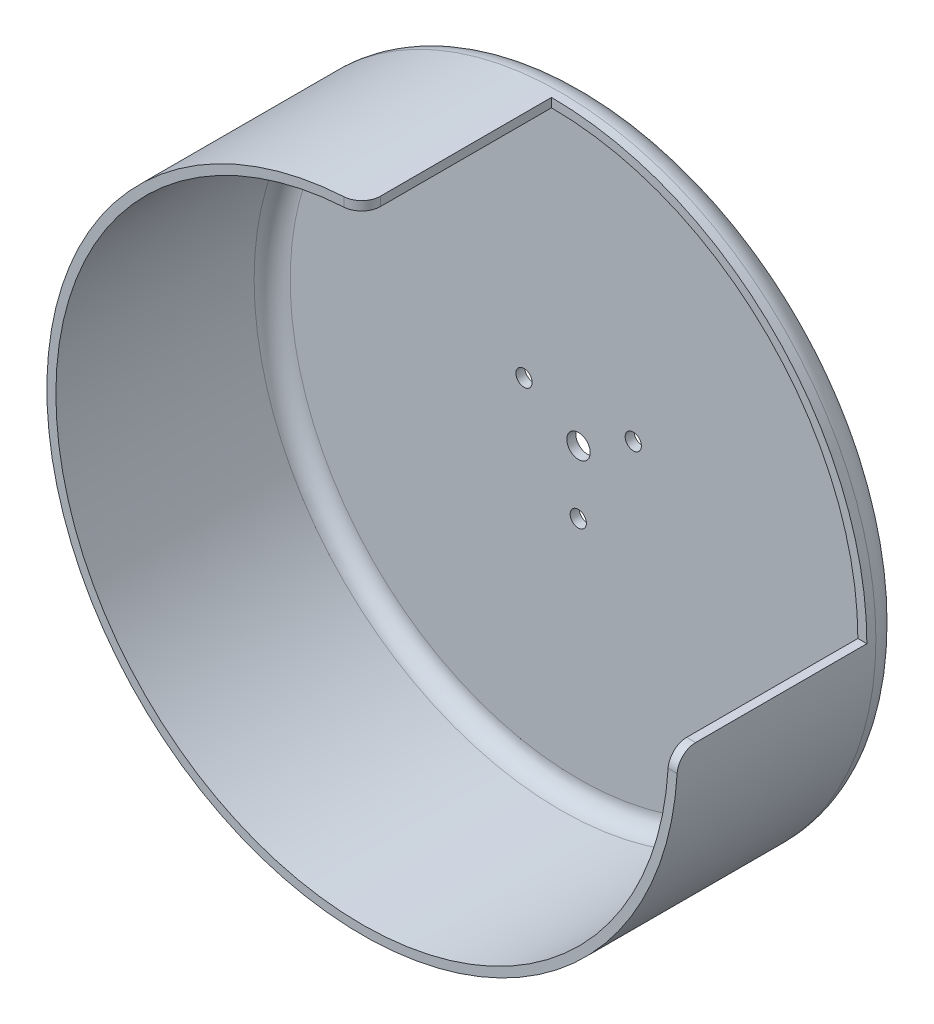
ISO-10303-21;
HEADER;
FILE_DESCRIPTION(('STEP AP214'),'2;1');
FILE_NAME('part.step','',(''),(''),'','','');
FILE_SCHEMA(('AUTOMOTIVE_DESIGN { 1 0 10303 214 1 1 1 1 }'));
ENDSEC;
DATA;
#1=APPLICATION_CONTEXT('core data for automotive mechanical design processes');
#2=APPLICATION_PROTOCOL_DEFINITION('international standard','automotive_design',2000,#1);
#3=PRODUCT_CONTEXT('',#1,'mechanical');
#4=PRODUCT('Part','Part','',(#3));
#5=PRODUCT_RELATED_PRODUCT_CATEGORY('part','',(#4));
#6=PRODUCT_DEFINITION_FORMATION('','',#4);
#7=PRODUCT_DEFINITION_CONTEXT('part definition',#1,'design');
#8=PRODUCT_DEFINITION('design','',#6,#7);
#9=PRODUCT_DEFINITION_SHAPE('','',#8);
#10=(LENGTH_UNIT() NAMED_UNIT(*) SI_UNIT(.MILLI.,.METRE.));
#11=(NAMED_UNIT(*) PLANE_ANGLE_UNIT() SI_UNIT($,.RADIAN.));
#12=(NAMED_UNIT(*) SI_UNIT($,.STERADIAN.) SOLID_ANGLE_UNIT());
#13=UNCERTAINTY_MEASURE_WITH_UNIT(LENGTH_MEASURE(1.E-05),#10,'distance_accuracy_value','');
#14=(GEOMETRIC_REPRESENTATION_CONTEXT(3) GLOBAL_UNCERTAINTY_ASSIGNED_CONTEXT((#13)) GLOBAL_UNIT_ASSIGNED_CONTEXT((#10,
#11,#12)) REPRESENTATION_CONTEXT('',''));
#15=CARTESIAN_POINT('',(0.,0.,0.));
#16=DIRECTION('',(0.,0.,1.));
#17=DIRECTION('',(1.,0.,0.));
#18=AXIS2_PLACEMENT_3D('',#15,#16,#17);
#19=CARTESIAN_POINT('',(0.,0.,125.));
#20=DIRECTION('',(0.,0.,-1.));
#21=DIRECTION('',(-1.,0.,0.));
#22=AXIS2_PLACEMENT_3D('',#19,#20,#21);
#23=CYLINDRICAL_SURFACE('',#22,175.);
#24=CARTESIAN_POINT('',(0.,0.,15.));
#25=DIRECTION('',(0.,0.,1.));
#26=DIRECTION('',(1.,0.,0.));
#27=AXIS2_PLACEMENT_3D('',#24,#25,#26);
#28=CIRCLE('',#27,175.);
#29=CARTESIAN_POINT('',(175.,0.,15.));
#30=VERTEX_POINT('',#29);
#31=EDGE_CURVE('E127',#30,#30,#28,.T.);
#32=ORIENTED_EDGE('',*,*,#31,.T.);
#33=EDGE_LOOP('',(#32));
#34=FACE_BOUND('',#33,.T.);
#35=DIRECTION('',(0.,0.,-1.));
#36=VECTOR('',#35,1.);
#37=CARTESIAN_POINT('',(175.,0.,125.));
#38=LINE('',#37,#36);
#39=CARTESIAN_POINT('',(175.,0.,115.));
#40=VERTEX_POINT('',#39);
#41=CARTESIAN_POINT('',(175.,0.,20.));
#42=VERTEX_POINT('',#41);
#43=EDGE_CURVE('E89',#40,#42,#38,.T.);
#44=ORIENTED_EDGE('',*,*,#43,.F.);
#45=CARTESIAN_POINT('',(175.,0.,115.));
#46=CARTESIAN_POINT('',(174.999994892222,3.02398528542552E-05,115.28125147425));
#47=CARTESIAN_POINT('',(174.999999839605,-0.0118640897200235,115.562498606137));
#48=CARTESIAN_POINT('',(174.999992929181,-0.0592834783585311,116.122980780399));
#49=CARTESIAN_POINT('',(174.99998107218,-0.0948074071604252,116.402215918368));
#50=CARTESIAN_POINT('',(174.99990367308,-0.189232212942811,116.956490123784));
#51=CARTESIAN_POINT('',(174.999838171239,-0.248115543132159,117.231532180264));
#52=CARTESIAN_POINT('',(174.999582255961,-0.388830803912559,117.775677944453));
#53=CARTESIAN_POINT('',(174.999391844049,-0.470662454310407,118.044781724624));
#54=CARTESIAN_POINT('',(174.998792383619,-0.656740455602465,118.57526956643));
#55=CARTESIAN_POINT('',(174.998383230455,-0.760997520385164,118.836649869996));
#56=CARTESIAN_POINT('',(174.997230930753,-0.991163412497808,119.349702759875));
#57=CARTESIAN_POINT('',(174.996487777208,-1.11707269390994,119.601375142461));
#58=CARTESIAN_POINT('',(174.994535661659,-1.38962078932135,120.093171113706));
#59=CARTESIAN_POINT('',(174.99332678503,-1.53625580079054,120.333296810018));
#60=CARTESIAN_POINT('',(174.990299257271,-1.84922825400883,120.800339608811));
#61=CARTESIAN_POINT('',(174.988480609517,-2.01556558668248,121.027256784405));
#62=CARTESIAN_POINT('',(174.984083250416,-2.36673350274791,121.466238253799));
#63=CARTESIAN_POINT('',(174.981504647814,-2.55156143775629,121.678304667277));
#64=CARTESIAN_POINT('',(174.975435818167,-2.93841303379434,122.086111744753));
#65=CARTESIAN_POINT('',(174.971945591629,-3.14043668526977,122.281852417822));
#66=CARTESIAN_POINT('',(174.96390626256,-3.56027873274718,122.65565171139));
#67=CARTESIAN_POINT('',(174.959356958049,-3.77810013614725,122.833706949767));
#68=CARTESIAN_POINT('',(174.949064292085,-4.22794372083137,123.170824159868));
#69=CARTESIAN_POINT('',(174.943320949441,-4.459965678399,123.329886430692));
#70=CARTESIAN_POINT('',(174.93052350261,-4.93646813234572,123.627837003842));
#71=CARTESIAN_POINT('',(174.923469879389,-5.18094403343454,123.766732675496));
#72=CARTESIAN_POINT('',(174.907954071214,-5.68067724046133,124.023434110065));
#73=CARTESIAN_POINT('',(174.899491909682,-5.93593436708343,124.141240223576));
#74=CARTESIAN_POINT('',(174.881092313057,-6.45530857954798,124.354889537395));
#75=CARTESIAN_POINT('',(174.871155526444,-6.71942173155645,124.450742344972));
#76=CARTESIAN_POINT('',(174.849770800619,-7.2546145110467,124.61985703665));
#77=CARTESIAN_POINT('',(174.838323221548,-7.52569246590007,124.69312429084));
#78=CARTESIAN_POINT('',(174.810001490825,-8.16049632651197,124.836314411567));
#79=CARTESIAN_POINT('',(174.792561510118,-8.52617763219225,124.897705856778));
#80=CARTESIAN_POINT('',(174.76450454658,-9.07755022000016,124.95908190891));
#81=CARTESIAN_POINT('',(174.754841455042,-9.26172181222213,124.974422065663));
#82=CARTESIAN_POINT('',(174.734901889189,-9.63058607172551,124.994879829498));
#83=CARTESIAN_POINT('',(174.7246254574,-9.81527870203658,124.999998144467));
#84=CARTESIAN_POINT('',(174.714052096561,-10.,125.));
#85=B_SPLINE_CURVE_WITH_KNOTS('',3,(#45,#46,#47,#48,#49,#50,#51,#52,#53,#54,#55,#56,#57,#58,#59,
#60,#61,#62,#63,#64,#65,#66,#67,#68,#69,#70,#71,#72,#73,#74,#75,#76,#77,#78,#79,#80,#81,#82,#83,
#84),.UNSPECIFIED.,.F.,.F.,(4,2,2,2,2,2,2,2,2,2,2,2,2,2,2,2,2,2,2,4),(0.,0.843496900529733,
1.68695345736179,2.52977763424749,3.37259152091049,4.21580896534211,5.0590440955715,
5.90212471858356,6.74520067437359,7.58815604997093,8.43111095721021,9.27422676006706,
10.1173292838423,10.9601229393869,11.8029025829052,12.6453126990533,13.4875223635445,
14.598545050804,15.1534922951335,15.7084011066519),.UNSPECIFIED.);
#86=CARTESIAN_POINT('',(174.714052096561,-10.,125.));
#87=VERTEX_POINT('',#86);
#88=EDGE_CURVE('E59',#40,#87,#85,.T.);
#89=ORIENTED_EDGE('',*,*,#88,.T.);
#90=CARTESIAN_POINT('',(0.,0.,125.));
#91=DIRECTION('',(0.,0.,1.));
#92=DIRECTION('',(1.,0.,0.));
#93=AXIS2_PLACEMENT_3D('',#90,#91,#92);
#94=CIRCLE('',#93,175.);
#95=CARTESIAN_POINT('',(-10.0000000000006,174.714052096561,125.));
#96=VERTEX_POINT('',#95);
#97=EDGE_CURVE('E114',#96,#87,#94,.T.);
#98=ORIENTED_EDGE('',*,*,#97,.F.);
#99=CARTESIAN_POINT('',(-10.0000000000006,174.714052096561,125.));
#100=CARTESIAN_POINT('',(-9.71924358284053,174.730128401738,125.000030359813));
#101=CARTESIAN_POINT('',(-9.43845042142782,174.745514433812,124.988177607693));
#102=CARTESIAN_POINT('',(-8.87878911571973,174.774840818622,124.940904589863));
#103=CARTESIAN_POINT('',(-8.59992090003551,174.788781225241,124.905485202946));
#104=CARTESIAN_POINT('',(-8.04628946510728,174.815142782463,124.811312079252));
#105=CARTESIAN_POINT('',(-7.77152339037183,174.827565037714,124.752575442566));
#106=CARTESIAN_POINT('',(-7.22784990919246,174.850885543135,124.612179464307));
#107=CARTESIAN_POINT('',(-6.95894241132248,174.861783817101,124.530520480724));
#108=CARTESIAN_POINT('',(-6.42876055196706,174.882078758652,124.344794825878));
#109=CARTESIAN_POINT('',(-6.16749032544867,174.891474624674,124.240716262387));
#110=CARTESIAN_POINT('',(-5.65459603087495,174.908808785999,124.010906362371));
#111=CARTESIAN_POINT('',(-5.40297216279331,174.916747051097,123.885174577261));
#112=CARTESIAN_POINT('',(-4.91122618914184,174.931244671529,123.612975223143));
#113=CARTESIAN_POINT('',(-4.67110179081402,174.937804302624,123.466511810826));
#114=CARTESIAN_POINT('',(-4.20401945545639,174.949652207129,123.153869433743));
#115=CARTESIAN_POINT('',(-3.97706143688348,174.954940488413,122.9876905911));
#116=CARTESIAN_POINT('',(-3.53812208986469,174.964367376378,122.63694885075));
#117=CARTESIAN_POINT('',(-3.326127993012,174.968506972272,122.45240195832));
#118=CARTESIAN_POINT('',(-2.9184119749696,174.975782480487,122.066114470968));
#119=CARTESIAN_POINT('',(-2.72269005648684,174.978918392641,121.864373873187));
#120=CARTESIAN_POINT('',(-2.34887295217695,174.984335747994,121.445087761269));
#121=CARTESIAN_POINT('',(-2.170781460415,174.986617012399,121.227538951361));
#122=CARTESIAN_POINT('',(-1.83354156287962,174.99047566243,120.77822291771));
#123=CARTESIAN_POINT('',(-1.67439287774756,174.992053058438,120.546455903727));
#124=CARTESIAN_POINT('',(-1.37607988856676,174.994653283278,120.07020678183));
#125=CARTESIAN_POINT('',(-1.23692729472386,174.995675788117,119.825717336572));
#126=CARTESIAN_POINT('',(-0.979709176579322,174.997304888308,119.32589353835));
#127=CARTESIAN_POINT('',(-0.861643312107746,174.99791149037,119.070559360416));
#128=CARTESIAN_POINT('',(-0.647482683750946,174.998834978388,118.550961393104));
#129=CARTESIAN_POINT('',(-0.55137799207792,174.999151995451,118.286701700863));
#130=CARTESIAN_POINT('',(-0.381777989140229,174.999604030813,117.751133933127));
#131=CARTESIAN_POINT('',(-0.308277303941761,174.999739092397,117.479827549589));
#132=CARTESIAN_POINT('',(-0.164507192141762,174.99994226013,116.844045536076));
#133=CARTESIAN_POINT('',(-0.102819961869466,174.999975043965,116.477572320914));
#134=CARTESIAN_POINT('',(-0.0411357184168811,174.999996164496,115.924886342338));
#135=CARTESIAN_POINT('',(-0.025715417854047,174.99999853456,115.740253789983));
#136=CARTESIAN_POINT('',(-0.00514883053197344,175.000000104599,115.37042948504));
#137=CARTESIAN_POINT('',(-1.86627262026528E-06,174.999999304782,115.185237770134));
#138=CARTESIAN_POINT('',(-6.10388961846379E-13,175.,115.));
#139=B_SPLINE_CURVE_WITH_KNOTS('',3,(#99,#100,#101,#102,#103,#104,#105,#106,#107,#108,#109,#110,
#111,#112,#113,#114,#115,#116,#117,#118,#119,#120,#121,#122,#123,#124,#125,#126,#127,#128,#129,
#130,#131,#132,#133,#134,#135,#136,#137,#138),.UNSPECIFIED.,.F.,.F.,(4,2,2,2,2,2,2,2,2,2,2,2,2,
2,2,2,2,2,2,4),(0.,0.843394586061134,1.68675772397901,2.52950350677246,3.37223612865741,
4.21541687478618,5.05861509102023,5.90164448490288,6.74466865710989,7.58696457378324,
8.42926063057613,9.27173279995783,10.1141925434602,10.957143658971,11.8000811748128,
12.6426368743721,13.4849921074739,14.5972647841675,15.1528513342814,15.7084012436802),.UNSPECIFIED.);
#140=CARTESIAN_POINT('',(-6.11009234297548E-13,175.,115.));
#141=VERTEX_POINT('',#140);
#142=EDGE_CURVE('E136',#96,#141,#139,.T.);
#143=ORIENTED_EDGE('',*,*,#142,.T.);
#144=DIRECTION('',(0.,0.,-1.));
#145=VECTOR('',#144,1.);
#146=CARTESIAN_POINT('',(-6.11009234297548E-13,175.,125.));
#147=LINE('',#146,#145);
#148=CARTESIAN_POINT('',(-6.11009234297548E-13,175.,20.));
#149=VERTEX_POINT('',#148);
#150=EDGE_CURVE('E111',#141,#149,#147,.T.);
#151=ORIENTED_EDGE('',*,*,#150,.T.);
#152=CARTESIAN_POINT('',(0.,0.,20.));
#153=DIRECTION('',(0.,0.,-1.));
#154=DIRECTION('',(-1.,0.,0.));
#155=AXIS2_PLACEMENT_3D('',#152,#153,#154);
#156=CIRCLE('',#155,175.);
#157=EDGE_CURVE('E103',#149,#42,#156,.T.);
#158=ORIENTED_EDGE('',*,*,#157,.T.);
#159=EDGE_LOOP('',(#44,#89,#98,#143,#151,#158));
#160=FACE_BOUND('',#159,.T.);
#161=ADVANCED_FACE('F32',(#34,#160),#23,.T.);
#162=CARTESIAN_POINT('',(0.,0.,125.));
#163=DIRECTION('',(0.,0.,1.));
#164=DIRECTION('',(1.,0.,0.));
#165=AXIS2_PLACEMENT_3D('',#162,#163,#164);
#166=PLANE('',#165);
#167=ORIENTED_EDGE('',*,*,#97,.T.);
#168=DIRECTION('',(1.,0.,0.));
#169=VECTOR('',#168,1.);
#170=CARTESIAN_POINT('',(0.,-10.,125.));
#171=LINE('',#170,#169);
#172=CARTESIAN_POINT('',(169.705627484771,-10.,125.));
#173=VERTEX_POINT('',#172);
#174=EDGE_CURVE('E45',#87,#173,#171,.F.);
#175=ORIENTED_EDGE('',*,*,#174,.T.);
#176=CARTESIAN_POINT('',(0.,0.,125.));
#177=DIRECTION('',(0.,0.,1.));
#178=DIRECTION('',(1.,0.,0.));
#179=AXIS2_PLACEMENT_3D('',#176,#177,#178);
#180=CIRCLE('',#179,170.);
#181=CARTESIAN_POINT('',(-10.0000000000006,169.705627484771,125.));
#182=VERTEX_POINT('',#181);
#183=EDGE_CURVE('E112',#182,#173,#180,.T.);
#184=ORIENTED_EDGE('',*,*,#183,.F.);
#185=DIRECTION('',(0.,1.,0.));
#186=VECTOR('',#185,1.);
#187=CARTESIAN_POINT('',(-10.0000000000006,175.,125.));
#188=LINE('',#187,#186);
#189=EDGE_CURVE('E133',#182,#96,#188,.T.);
#190=ORIENTED_EDGE('',*,*,#189,.T.);
#191=EDGE_LOOP('',(#167,#175,#184,#190));
#192=FACE_BOUND('',#191,.T.);
#193=ADVANCED_FACE('F151',(#192),#166,.T.);
#194=CARTESIAN_POINT('',(0.,0.,0.));
#195=DIRECTION('',(0.,0.,1.));
#196=DIRECTION('',(1.,0.,0.));
#197=AXIS2_PLACEMENT_3D('',#194,#195,#196);
#198=PLANE('',#197);
#199=CARTESIAN_POINT('',(30.3777801302187,17.3836266170235,0.));
#200=DIRECTION('',(0.,0.,1.));
#201=DIRECTION('',(1.,0.,0.));
#202=AXIS2_PLACEMENT_3D('',#199,#200,#201);
#203=CIRCLE('',#202,4.5);
#204=CARTESIAN_POINT('',(34.8777801302187,17.3836266170235,0.));
#205=VERTEX_POINT('',#204);
#206=EDGE_CURVE('E228',#205,#205,#203,.T.);
#207=ORIENTED_EDGE('',*,*,#206,.T.);
#208=EDGE_LOOP('',(#207));
#209=FACE_BOUND('',#208,.T.);
#210=CARTESIAN_POINT('',(-0.134227804863798,-34.9997426118593,0.));
#211=DIRECTION('',(0.,0.,1.));
#212=DIRECTION('',(1.,0.,0.));
#213=AXIS2_PLACEMENT_3D('',#210,#211,#212);
#214=CIRCLE('',#213,4.5);
#215=CARTESIAN_POINT('',(4.3657721951362,-34.9997426118593,0.));
#216=VERTEX_POINT('',#215);
#217=EDGE_CURVE('E232',#216,#216,#214,.T.);
#218=ORIENTED_EDGE('',*,*,#217,.T.);
#219=EDGE_LOOP('',(#218));
#220=FACE_BOUND('',#219,.T.);
#221=CARTESIAN_POINT('',(-30.2435523253549,17.6161159948361,0.));
#222=DIRECTION('',(0.,0.,1.));
#223=DIRECTION('',(1.,0.,0.));
#224=AXIS2_PLACEMENT_3D('',#221,#222,#223);
#225=CIRCLE('',#224,4.5);
#226=CARTESIAN_POINT('',(-25.7435523253549,17.6161159948361,0.));
#227=VERTEX_POINT('',#226);
#228=EDGE_CURVE('E241',#227,#227,#225,.T.);
#229=ORIENTED_EDGE('',*,*,#228,.T.);
#230=EDGE_LOOP('',(#229));
#231=FACE_BOUND('',#230,.T.);
#232=CARTESIAN_POINT('',(0.,0.,0.));
#233=DIRECTION('',(0.,0.,1.));
#234=DIRECTION('',(1.,0.,0.));
#235=AXIS2_PLACEMENT_3D('',#232,#233,#234);
#236=CIRCLE('',#235,6.5);
#237=CARTESIAN_POINT('',(6.5,0.,0.));
#238=VERTEX_POINT('',#237);
#239=EDGE_CURVE('E98',#238,#238,#236,.T.);
#240=ORIENTED_EDGE('',*,*,#239,.T.);
#241=EDGE_LOOP('',(#240));
#242=FACE_BOUND('',#241,.T.);
#243=CARTESIAN_POINT('',(0.,0.,0.));
#244=DIRECTION('',(0.,0.,1.));
#245=DIRECTION('',(1.,0.,0.));
#246=AXIS2_PLACEMENT_3D('',#243,#244,#245);
#247=CIRCLE('',#246,160.);
#248=CARTESIAN_POINT('',(160.,0.,0.));
#249=VERTEX_POINT('',#248);
#250=EDGE_CURVE('E130',#249,#249,#247,.F.);
#251=ORIENTED_EDGE('',*,*,#250,.T.);
#252=EDGE_LOOP('',(#251));
#253=FACE_BOUND('',#252,.T.);
#254=ADVANCED_FACE('F153',(#209,#220,#231,#242,#253),#198,.F.);
#255=CARTESIAN_POINT('',(0.,0.,125.));
#256=DIRECTION('',(0.,0.,-1.));
#257=DIRECTION('',(-1.,0.,0.));
#258=AXIS2_PLACEMENT_3D('',#255,#256,#257);
#259=CYLINDRICAL_SURFACE('',#258,170.);
#260=CARTESIAN_POINT('',(0.,0.,15.));
#261=DIRECTION('',(0.,0.,1.));
#262=DIRECTION('',(1.,0.,0.));
#263=AXIS2_PLACEMENT_3D('',#260,#261,#262);
#264=CIRCLE('',#263,170.);
#265=CARTESIAN_POINT('',(170.,0.,15.));
#266=VERTEX_POINT('',#265);
#267=EDGE_CURVE('E124',#266,#266,#264,.F.);
#268=ORIENTED_EDGE('',*,*,#267,.T.);
#269=EDGE_LOOP('',(#268));
#270=FACE_BOUND('',#269,.T.);
#271=ORIENTED_EDGE('',*,*,#183,.T.);
#272=CARTESIAN_POINT('',(169.705627484771,-10.,125.));
#273=CARTESIAN_POINT('',(169.722176465164,-9.7192736903606,125.000030366613));
#274=CARTESIAN_POINT('',(169.738014961169,-9.43850818552635,124.988180141239));
#275=CARTESIAN_POINT('',(169.768203933085,-8.87889698483317,124.940916041262));
#276=CARTESIAN_POINT('',(169.782554463515,-8.60005121898717,124.905503030323));
#277=CARTESIAN_POINT('',(169.809691758672,-8.04645913239074,124.811345276624));
#278=CARTESIAN_POINT('',(169.822479658256,-7.77170996535653,124.752617599376));
#279=CARTESIAN_POINT('',(169.846486742159,-7.22806551553177,124.612241159697));
#280=CARTESIAN_POINT('',(169.857705951291,-6.9591701402032,124.530592759886));
#281=CARTESIAN_POINT('',(169.878598710019,-6.42900729806899,124.344888755505));
#282=CARTESIAN_POINT('',(169.888271429434,-6.1677439893722,124.240821185848));
#283=CARTESIAN_POINT('',(169.906116456283,-5.65485984289939,124.011033292972));
#284=CARTESIAN_POINT('',(169.914288732664,-5.40323920476951,123.88531252173));
#285=CARTESIAN_POINT('',(169.929213808422,-4.91149688515462,123.613134923551));
#286=CARTESIAN_POINT('',(169.935966893022,-4.67137290063233,123.466682273129));
#287=CARTESIAN_POINT('',(169.948164284981,-4.2042889549479,123.154060816414));
#288=CARTESIAN_POINT('',(169.953608600509,-3.97732891162504,122.987892133195));
#289=CARTESIAN_POINT('',(169.963313450578,-3.5383948282431,122.63717894909));
#290=CARTESIAN_POINT('',(169.967575063643,-3.32640726697199,122.452651399962));
#291=CARTESIAN_POINT('',(169.975065129626,-2.91870109378392,122.066403527707));
#292=CARTESIAN_POINT('',(169.978293582364,-2.72298248471154,121.864683201574));
#293=CARTESIAN_POINT('',(169.983870902175,-2.34916883809588,121.44543828075));
#294=CARTESIAN_POINT('',(169.986219584912,-2.17107749968761,121.227910385333));
#295=CARTESIAN_POINT('',(169.990192357067,-1.83383486627035,120.778636644488));
#296=CARTESIAN_POINT('',(169.991816457145,-1.67468329266968,120.546891008271));
#297=CARTESIAN_POINT('',(169.994493775723,-1.37635821177166,120.070679615096));
#298=CARTESIAN_POINT('',(169.995546648079,-1.23719685538734,119.826206243634));
#299=CARTESIAN_POINT('',(169.997224185904,-0.97995912594128,119.326414070102));
#300=CARTESIAN_POINT('',(169.99784885827,-0.861882413392274,119.071095442735));
#301=CARTESIAN_POINT('',(169.998799900078,-0.647698018407803,118.551527742581));
#302=CARTESIAN_POINT('',(169.999126404401,-0.551580417315926,118.287282763872));
#303=CARTESIAN_POINT('',(169.999591999165,-0.381952629643169,117.751743474542));
#304=CARTESIAN_POINT('',(169.999731134149,-0.308437073238509,117.480450854944));
#305=CARTESIAN_POINT('',(169.999940492236,-0.164603585355966,116.844581366987));
#306=CARTESIAN_POINT('',(169.999974279823,-0.102880264565263,116.478003376095));
#307=CARTESIAN_POINT('',(169.999996047043,-0.0411598721645464,115.925157347325));
#308=CARTESIAN_POINT('',(169.999998489683,-0.0257305197627736,115.740470887725));
#309=CARTESIAN_POINT('',(170.000000107804,-0.0051518582440614,115.370538294447));
#310=CARTESIAN_POINT('',(169.999999283501,-1.86977894450687E-06,115.185292198565));
#311=CARTESIAN_POINT('',(170.,0.,115.));
#312=B_SPLINE_CURVE_WITH_KNOTS('',3,(#272,#273,#274,#275,#276,#277,#278,#279,#280,#281,#282,
#283,#284,#285,#286,#287,#288,#289,#290,#291,#292,#293,#294,#295,#296,#297,#298,#299,#300,#301,
#302,#303,#304,#305,#306,#307,#308,#309,#310,#311),.UNSPECIFIED.,.F.,.F.,(4,2,2,2,2,2,2,2,2,2,2,
2,2,2,2,2,2,2,2,4),(0.,0.843386862433242,1.68674281331487,2.52948259224286,3.37220903926826,
4.21538636764182,5.05858114411238,5.9016062969314,6.74462618757179,7.58687477080561,
8.42912350130372,9.27154860711524,10.1139613198664,10.9568839399474,11.7997929867706,
12.6423205460289,13.4846477815128,14.5972459805361,15.152995747497,15.7087087845496),.UNSPECIFIED.);
#313=CARTESIAN_POINT('',(170.,0.,115.));
#314=VERTEX_POINT('',#313);
#315=EDGE_CURVE('E11',#173,#314,#312,.T.);
#316=ORIENTED_EDGE('',*,*,#315,.T.);
#317=DIRECTION('',(0.,0.,1.));
#318=VECTOR('',#317,1.);
#319=CARTESIAN_POINT('',(170.,0.,125.));
#320=LINE('',#319,#318);
#321=CARTESIAN_POINT('',(170.,0.,20.));
#322=VERTEX_POINT('',#321);
#323=EDGE_CURVE('E108',#322,#314,#320,.T.);
#324=ORIENTED_EDGE('',*,*,#323,.F.);
#325=CARTESIAN_POINT('',(0.,0.,20.));
#326=DIRECTION('',(0.,0.,-1.));
#327=DIRECTION('',(-1.,0.,0.));
#328=AXIS2_PLACEMENT_3D('',#325,#326,#327);
#329=CIRCLE('',#328,170.);
#330=CARTESIAN_POINT('',(-5.93551827603333E-13,170.,20.));
#331=VERTEX_POINT('',#330);
#332=EDGE_CURVE('E106',#331,#322,#329,.T.);
#333=ORIENTED_EDGE('',*,*,#332,.F.);
#334=DIRECTION('',(0.,0.,1.));
#335=VECTOR('',#334,1.);
#336=CARTESIAN_POINT('',(-5.93551827603333E-13,170.,125.));
#337=LINE('',#336,#335);
#338=CARTESIAN_POINT('',(-5.93551827603333E-13,170.,115.));
#339=VERTEX_POINT('',#338);
#340=EDGE_CURVE('E116',#331,#339,#337,.T.);
#341=ORIENTED_EDGE('',*,*,#340,.T.);
#342=CARTESIAN_POINT('',(-5.93551827603333E-13,170.,115.));
#343=CARTESIAN_POINT('',(3.02396190058065E-05,169.999994742034,115.281250932257));
#344=CARTESIAN_POINT('',(-0.0118640440033635,169.999999834888,115.562497522227));
#345=CARTESIAN_POINT('',(-0.0592832502388858,169.999992721272,116.122978626492));
#346=CARTESIAN_POINT('',(-0.0948070427868023,169.999980515629,116.402213236363));
#347=CARTESIAN_POINT('',(-0.189231503371657,169.999900840681,116.956486501604));
#348=CARTESIAN_POINT('',(-0.248114632519326,169.999833412799,117.231528144654));
#349=CARTESIAN_POINT('',(-0.388829420420072,169.99956997241,117.775673108666));
#350=CARTESIAN_POINT('',(-0.470660798977431,169.999373961474,118.04477650209));
#351=CARTESIAN_POINT('',(-0.656738196364177,169.998756873817,118.575263629199));
#352=CARTESIAN_POINT('',(-0.760994931758005,169.998335689347,118.836643603879));
#353=CARTESIAN_POINT('',(-0.991160087640903,169.997149505389,119.349695844489));
#354=CARTESIAN_POINT('',(-1.11706896197945,169.996384498692,119.601367906796));
#355=CARTESIAN_POINT('',(-1.38961614295128,169.99437497837,120.093163231144));
#356=CARTESIAN_POINT('',(-1.5362506483871,169.993130552602,120.333288600114));
#357=CARTESIAN_POINT('',(-1.84922190983613,169.990013993653,120.80033066257));
#358=CARTESIAN_POINT('',(-2.01555855659975,169.988141863952,121.027247429287));
#359=CARTESIAN_POINT('',(-2.36672336040849,169.983615205961,121.466226142222));
#360=CARTESIAN_POINT('',(-2.55154871891926,169.980960795961,121.678290328356));
#361=CARTESIAN_POINT('',(-2.93839435194879,169.974713557458,122.08609298196));
#362=CARTESIAN_POINT('',(-3.14041461632024,169.971120729508,122.281831459065));
#363=CARTESIAN_POINT('',(-3.56024863317826,169.96284508157,122.655626222866));
#364=CARTESIAN_POINT('',(-3.77806538084224,169.958162054494,122.833679140952));
#365=CARTESIAN_POINT('',(-4.22789813653081,169.947566858921,123.170791761061));
#366=CARTESIAN_POINT('',(-4.45991392055705,169.941654709809,123.329851762593));
#367=CARTESIAN_POINT('',(-4.93639379178512,169.928481373658,123.627792822754));
#368=CARTESIAN_POINT('',(-5.18085285201773,169.921220728308,123.766681944214));
#369=CARTESIAN_POINT('',(-5.68054911800542,169.905249616852,124.023372188539));
#370=CARTESIAN_POINT('',(-5.93578614451303,169.896539174851,124.141173661939));
#371=CARTESIAN_POINT('',(-6.45511684226208,169.877599811824,124.354816246013));
#372=CARTESIAN_POINT('',(-6.71920659237818,169.867371556378,124.450666935755));
#373=CARTESIAN_POINT('',(-7.25434863816732,169.84535966544,124.619780448102));
#374=CARTESIAN_POINT('',(-7.52539926327746,169.833576400381,124.693048636477));
#375=CARTESIAN_POINT('',(-8.16023225385565,169.804419814569,124.836267374793));
#376=CARTESIAN_POINT('',(-8.52597099153115,169.786463370002,124.897677144722));
#377=CARTESIAN_POINT('',(-9.07742506042152,169.757575197789,124.959070831695));
#378=CARTESIAN_POINT('',(-9.26162297650162,169.747625780551,124.974415225023));
#379=CARTESIAN_POINT('',(-9.63053806343713,169.727095297823,124.994878524197));
#380=CARTESIAN_POINT('',(-9.81525519726299,169.71651427634,124.999998141609));
#381=CARTESIAN_POINT('',(-10.0000000000006,169.705627484771,125.));
#382=B_SPLINE_CURVE_WITH_KNOTS('',3,(#342,#343,#344,#345,#346,#347,#348,#349,#350,#351,#352,
#353,#354,#355,#356,#357,#358,#359,#360,#361,#362,#363,#364,#365,#366,#367,#368,#369,#370,#371,
#372,#373,#374,#375,#376,#377,#378,#379,#380,#381),.UNSPECIFIED.,.F.,.F.,(4,2,2,2,2,2,2,2,2,2,2,
2,2,2,2,2,2,2,2,4),(0.,0.843495276120307,1.68695021555121,2.5297730587412,3.37258561160071,
4.21580182364747,5.05903571246475,5.90211514763374,6.74518990809347,7.58813724951684,
8.43108409349091,9.27419118894984,10.1172849873127,10.9600408457772,11.8027826939538,
12.6451560755991,13.4873291485076,14.5986027139363,15.1536749925278,15.708708640995),.UNSPECIFIED.);
#383=EDGE_CURVE('E162',#339,#182,#382,.T.);
#384=ORIENTED_EDGE('',*,*,#383,.T.);
#385=EDGE_LOOP('',(#271,#316,#324,#333,#341,#384));
#386=FACE_BOUND('',#385,.T.);
#387=ADVANCED_FACE('F166',(#270,#386),#259,.F.);
#388=CARTESIAN_POINT('',(0.,0.,5.));
#389=DIRECTION('',(0.,0.,1.));
#390=DIRECTION('',(1.,0.,0.));
#391=AXIS2_PLACEMENT_3D('',#388,#389,#390);
#392=PLANE('',#391);
#393=CARTESIAN_POINT('',(30.3777801302187,17.3836266170235,5.));
#394=DIRECTION('',(0.,0.,1.));
#395=DIRECTION('',(-0.499999999999992,-0.866025403784443,0.));
#396=AXIS2_PLACEMENT_3D('',#393,#394,#395);
#397=CIRCLE('',#396,4.5);
#398=CARTESIAN_POINT('',(28.1277801302188,13.4865122999935,5.));
#399=VERTEX_POINT('',#398);
#400=EDGE_CURVE('E225',#399,#399,#397,.T.);
#401=ORIENTED_EDGE('',*,*,#400,.F.);
#402=EDGE_LOOP('',(#401));
#403=FACE_BOUND('',#402,.T.);
#404=CARTESIAN_POINT('',(-0.134227804863798,-34.9997426118593,5.));
#405=DIRECTION('',(0.,0.,1.));
#406=DIRECTION('',(-0.500000000000004,0.866025403784436,0.));
#407=AXIS2_PLACEMENT_3D('',#404,#405,#406);
#408=CIRCLE('',#407,4.5);
#409=CARTESIAN_POINT('',(-2.38422780486382,-31.1026282948294,5.));
#410=VERTEX_POINT('',#409);
#411=EDGE_CURVE('E229',#410,#410,#408,.T.);
#412=ORIENTED_EDGE('',*,*,#411,.F.);
#413=EDGE_LOOP('',(#412));
#414=FACE_BOUND('',#413,.T.);
#415=CARTESIAN_POINT('',(-30.2435523253549,17.6161159948361,5.));
#416=DIRECTION('',(0.,0.,1.));
#417=DIRECTION('',(1.,0.,0.));
#418=AXIS2_PLACEMENT_3D('',#415,#416,#417);
#419=CIRCLE('',#418,4.5);
#420=CARTESIAN_POINT('',(-25.7435523253549,17.6161159948361,5.));
#421=VERTEX_POINT('',#420);
#422=EDGE_CURVE('E238',#421,#421,#419,.T.);
#423=ORIENTED_EDGE('',*,*,#422,.F.);
#424=EDGE_LOOP('',(#423));
#425=FACE_BOUND('',#424,.T.);
#426=CARTESIAN_POINT('',(0.,0.,5.));
#427=DIRECTION('',(0.,0.,1.));
#428=DIRECTION('',(1.,0.,0.));
#429=AXIS2_PLACEMENT_3D('',#426,#427,#428);
#430=CIRCLE('',#429,6.5);
#431=CARTESIAN_POINT('',(6.5,0.,5.));
#432=VERTEX_POINT('',#431);
#433=EDGE_CURVE('E244',#432,#432,#430,.T.);
#434=ORIENTED_EDGE('',*,*,#433,.F.);
#435=EDGE_LOOP('',(#434));
#436=FACE_BOUND('',#435,.T.);
#437=CARTESIAN_POINT('',(0.,0.,5.));
#438=DIRECTION('',(0.,0.,1.));
#439=DIRECTION('',(1.,0.,0.));
#440=AXIS2_PLACEMENT_3D('',#437,#438,#439);
#441=CIRCLE('',#440,160.);
#442=CARTESIAN_POINT('',(160.,0.,5.));
#443=VERTEX_POINT('',#442);
#444=EDGE_CURVE('E121',#443,#443,#441,.T.);
#445=ORIENTED_EDGE('',*,*,#444,.T.);
#446=EDGE_LOOP('',(#445));
#447=FACE_BOUND('',#446,.T.);
#448=ADVANCED_FACE('F171',(#403,#414,#425,#436,#447),#392,.T.);
#449=CARTESIAN_POINT('',(-6.11009234297548E-13,175.,20.));
#450=DIRECTION('',(0.,0.,1.));
#451=DIRECTION('',(1.,0.,0.));
#452=AXIS2_PLACEMENT_3D('',#449,#450,#451);
#453=PLANE('',#452);
#454=ORIENTED_EDGE('',*,*,#332,.T.);
#455=DIRECTION('',(-1.,0.,0.));
#456=VECTOR('',#455,1.);
#457=CARTESIAN_POINT('',(175.,0.,20.));
#458=LINE('',#457,#456);
#459=EDGE_CURVE('E93',#42,#322,#458,.T.);
#460=ORIENTED_EDGE('',*,*,#459,.F.);
#461=ORIENTED_EDGE('',*,*,#157,.F.);
#462=DIRECTION('',(0.,-1.,0.));
#463=VECTOR('',#462,1.);
#464=CARTESIAN_POINT('',(-6.11009234297548E-13,175.,20.));
#465=LINE('',#464,#463);
#466=EDGE_CURVE('E187',#149,#331,#465,.T.);
#467=ORIENTED_EDGE('',*,*,#466,.T.);
#468=EDGE_LOOP('',(#454,#460,#461,#467));
#469=FACE_BOUND('',#468,.T.);
#470=ADVANCED_FACE('F102',(#469),#453,.T.);
#471=CARTESIAN_POINT('',(-6.11009234297548E-13,175.,20.));
#472=DIRECTION('',(-1.,0.,0.));
#473=DIRECTION('',(0.,0.,1.));
#474=AXIS2_PLACEMENT_3D('',#471,#472,#473);
#475=PLANE('',#474);
#476=ORIENTED_EDGE('',*,*,#150,.F.);
#477=DIRECTION('',(0.,1.,0.));
#478=VECTOR('',#477,1.);
#479=CARTESIAN_POINT('',(-5.93551827603333E-13,170.,115.));
#480=LINE('',#479,#478);
#481=EDGE_CURVE('E142',#141,#339,#480,.F.);
#482=ORIENTED_EDGE('',*,*,#481,.T.);
#483=ORIENTED_EDGE('',*,*,#340,.F.);
#484=ORIENTED_EDGE('',*,*,#466,.F.);
#485=EDGE_LOOP('',(#476,#482,#483,#484));
#486=FACE_BOUND('',#485,.T.);
#487=ADVANCED_FACE('F196',(#486),#475,.F.);
#488=CARTESIAN_POINT('',(175.,0.,20.));
#489=DIRECTION('',(0.,1.,0.));
#490=DIRECTION('',(0.,0.,1.));
#491=AXIS2_PLACEMENT_3D('',#488,#489,#490);
#492=PLANE('',#491);
#493=ORIENTED_EDGE('',*,*,#323,.T.);
#494=DIRECTION('',(1.,0.,0.));
#495=VECTOR('',#494,1.);
#496=CARTESIAN_POINT('',(175.,0.,115.));
#497=LINE('',#496,#495);
#498=EDGE_CURVE('E96',#314,#40,#497,.T.);
#499=ORIENTED_EDGE('',*,*,#498,.T.);
#500=ORIENTED_EDGE('',*,*,#43,.T.);
#501=ORIENTED_EDGE('',*,*,#459,.T.);
#502=EDGE_LOOP('',(#493,#499,#500,#501));
#503=FACE_BOUND('',#502,.T.);
#504=ADVANCED_FACE('F92',(#503),#492,.T.);
#505=CARTESIAN_POINT('',(0.,0.,15.));
#506=DIRECTION('',(0.,0.,1.));
#507=DIRECTION('',(1.,0.,0.));
#508=AXIS2_PLACEMENT_3D('',#505,#506,#507);
#509=TOROIDAL_SURFACE('',#508,160.,10.);
#510=ORIENTED_EDGE('',*,*,#267,.F.);
#511=EDGE_LOOP('',(#510));
#512=FACE_BOUND('',#511,.T.);
#513=ORIENTED_EDGE('',*,*,#444,.F.);
#514=EDGE_LOOP('',(#513));
#515=FACE_BOUND('',#514,.T.);
#516=ADVANCED_FACE('F155',(#512,#515),#509,.F.);
#517=CARTESIAN_POINT('',(0.,0.,15.));
#518=DIRECTION('',(0.,0.,1.));
#519=DIRECTION('',(1.,0.,0.));
#520=AXIS2_PLACEMENT_3D('',#517,#518,#519);
#521=TOROIDAL_SURFACE('',#520,160.,15.);
#522=ORIENTED_EDGE('',*,*,#250,.F.);
#523=EDGE_LOOP('',(#522));
#524=FACE_BOUND('',#523,.T.);
#525=ORIENTED_EDGE('',*,*,#31,.F.);
#526=EDGE_LOOP('',(#525));
#527=FACE_BOUND('',#526,.T.);
#528=ADVANCED_FACE('F207',(#524,#527),#521,.T.);
#529=CARTESIAN_POINT('',(0.,0.,-120.));
#530=DIRECTION('',(0.,0.,1.));
#531=DIRECTION('',(1.,0.,0.));
#532=AXIS2_PLACEMENT_3D('',#529,#530,#531);
#533=CYLINDRICAL_SURFACE('',#532,6.5);
#534=ORIENTED_EDGE('',*,*,#433,.T.);
#535=EDGE_LOOP('',(#534));
#536=FACE_BOUND('',#535,.T.);
#537=ORIENTED_EDGE('',*,*,#239,.F.);
#538=EDGE_LOOP('',(#537));
#539=FACE_BOUND('',#538,.T.);
#540=ADVANCED_FACE('F204',(#536,#539),#533,.F.);
#541=CARTESIAN_POINT('',(-10.,0.,115.));
#542=DIRECTION('',(0.,-1.,0.));
#543=DIRECTION('',(1.,0.,0.));
#544=AXIS2_PLACEMENT_3D('',#541,#542,#543);
#545=CYLINDRICAL_SURFACE('',#544,10.);
#546=ORIENTED_EDGE('',*,*,#383,.F.);
#547=ORIENTED_EDGE('',*,*,#481,.F.);
#548=ORIENTED_EDGE('',*,*,#142,.F.);
#549=ORIENTED_EDGE('',*,*,#189,.F.);
#550=EDGE_LOOP('',(#546,#547,#548,#549));
#551=FACE_BOUND('',#550,.T.);
#552=ADVANCED_FACE('F144',(#551),#545,.T.);
#553=CARTESIAN_POINT('',(175.,-10.,115.));
#554=DIRECTION('',(1.,0.,0.));
#555=DIRECTION('',(0.,0.,-1.));
#556=AXIS2_PLACEMENT_3D('',#553,#554,#555);
#557=CYLINDRICAL_SURFACE('',#556,10.);
#558=ORIENTED_EDGE('',*,*,#315,.F.);
#559=ORIENTED_EDGE('',*,*,#174,.F.);
#560=ORIENTED_EDGE('',*,*,#88,.F.);
#561=ORIENTED_EDGE('',*,*,#498,.F.);
#562=EDGE_LOOP('',(#558,#559,#560,#561));
#563=FACE_BOUND('',#562,.T.);
#564=ADVANCED_FACE('F34',(#563),#557,.T.);
#565=CARTESIAN_POINT('',(-30.2435523253549,17.6161159948361,-120.));
#566=DIRECTION('',(0.,0.,1.));
#567=DIRECTION('',(1.,0.,0.));
#568=AXIS2_PLACEMENT_3D('',#565,#566,#567);
#569=CYLINDRICAL_SURFACE('',#568,4.5);
#570=ORIENTED_EDGE('',*,*,#422,.T.);
#571=EDGE_LOOP('',(#570));
#572=FACE_BOUND('',#571,.T.);
#573=ORIENTED_EDGE('',*,*,#228,.F.);
#574=EDGE_LOOP('',(#573));
#575=FACE_BOUND('',#574,.T.);
#576=ADVANCED_FACE('F209',(#572,#575),#569,.F.);
#577=CARTESIAN_POINT('',(-0.134227804863798,-34.9997426118593,-120.));
#578=DIRECTION('',(0.,0.,1.));
#579=DIRECTION('',(1.,0.,0.));
#580=AXIS2_PLACEMENT_3D('',#577,#578,#579);
#581=CYLINDRICAL_SURFACE('',#580,4.5);
#582=ORIENTED_EDGE('',*,*,#411,.T.);
#583=EDGE_LOOP('',(#582));
#584=FACE_BOUND('',#583,.T.);
#585=ORIENTED_EDGE('',*,*,#217,.F.);
#586=EDGE_LOOP('',(#585));
#587=FACE_BOUND('',#586,.T.);
#588=ADVANCED_FACE('F212',(#584,#587),#581,.F.);
#589=CARTESIAN_POINT('',(30.3777801302187,17.3836266170235,-120.));
#590=DIRECTION('',(0.,0.,1.));
#591=DIRECTION('',(1.,0.,0.));
#592=AXIS2_PLACEMENT_3D('',#589,#590,#591);
#593=CYLINDRICAL_SURFACE('',#592,4.5);
#594=ORIENTED_EDGE('',*,*,#400,.T.);
#595=EDGE_LOOP('',(#594));
#596=FACE_BOUND('',#595,.T.);
#597=ORIENTED_EDGE('',*,*,#206,.F.);
#598=EDGE_LOOP('',(#597));
#599=FACE_BOUND('',#598,.T.);
#600=ADVANCED_FACE('F216',(#596,#599),#593,.F.);
#601=CLOSED_SHELL('',(#161,#193,#254,#387,#448,#470,#487,#504,#516,#528,#540,#552,#564,#576,
#588,#600));
#602=MANIFOLD_SOLID_BREP('B2',#601);
#603=ADVANCED_BREP_SHAPE_REPRESENTATION('',(#18,#602),#14);
#604=SHAPE_DEFINITION_REPRESENTATION(#9,#603);
ENDSEC;
END-ISO-10303-21;
